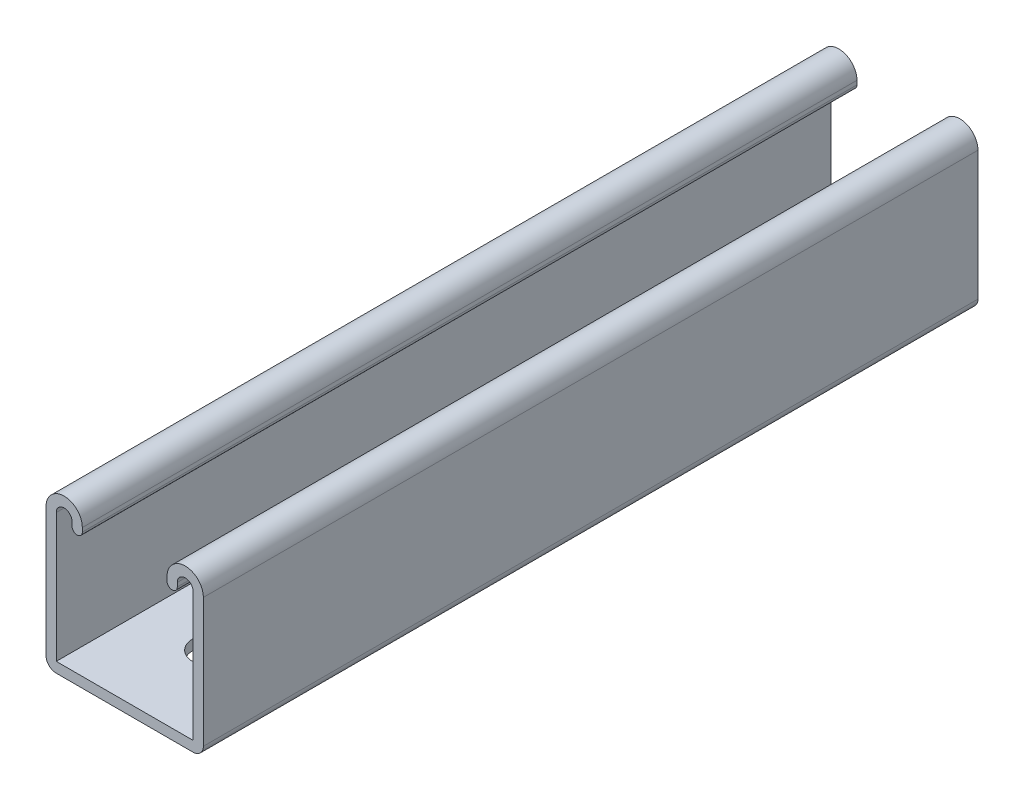
ISO-10303-21;
HEADER;
FILE_DESCRIPTION(('STEP AP214'),'2;1');
FILE_NAME('part.step','',(''),(''),'','','');
FILE_SCHEMA(('AUTOMOTIVE_DESIGN { 1 0 10303 214 1 1 1 1 }'));
ENDSEC;
DATA;
#1=APPLICATION_CONTEXT('core data for automotive mechanical design processes');
#2=APPLICATION_PROTOCOL_DEFINITION('international standard','automotive_design',2000,#1);
#3=PRODUCT_CONTEXT('',#1,'mechanical');
#4=PRODUCT('Part','Part','',(#3));
#5=PRODUCT_RELATED_PRODUCT_CATEGORY('part','',(#4));
#6=PRODUCT_DEFINITION_FORMATION('','',#4);
#7=PRODUCT_DEFINITION_CONTEXT('part definition',#1,'design');
#8=PRODUCT_DEFINITION('design','',#6,#7);
#9=PRODUCT_DEFINITION_SHAPE('','',#8);
#10=(LENGTH_UNIT() NAMED_UNIT(*) SI_UNIT(.MILLI.,.METRE.));
#11=(NAMED_UNIT(*) PLANE_ANGLE_UNIT() SI_UNIT($,.RADIAN.));
#12=(NAMED_UNIT(*) SI_UNIT($,.STERADIAN.) SOLID_ANGLE_UNIT());
#13=UNCERTAINTY_MEASURE_WITH_UNIT(LENGTH_MEASURE(1.E-05),#10,'distance_accuracy_value','');
#14=(GEOMETRIC_REPRESENTATION_CONTEXT(3) GLOBAL_UNCERTAINTY_ASSIGNED_CONTEXT((#13)) GLOBAL_UNIT_ASSIGNED_CONTEXT((#10,
#11,#12)) REPRESENTATION_CONTEXT('',''));
#15=CARTESIAN_POINT('',(0.,0.,0.));
#16=DIRECTION('',(0.,0.,1.));
#17=DIRECTION('',(1.,0.,0.));
#18=AXIS2_PLACEMENT_3D('',#15,#16,#17);
#19=CARTESIAN_POINT('',(-15.875,18.4785,203.2));
#20=DIRECTION('',(0.,0.,-1.));
#21=DIRECTION('',(-1.,0.,0.));
#22=AXIS2_PLACEMENT_3D('',#19,#20,#21);
#23=CYLINDRICAL_SURFACE('',#22,4.7625);
#24=CARTESIAN_POINT('',(-15.875,18.4785,0.));
#25=DIRECTION('',(0.,0.,1.));
#26=DIRECTION('',(-1.,0.,0.));
#27=AXIS2_PLACEMENT_3D('',#24,#25,#26);
#28=CIRCLE('',#27,4.7625);
#29=CARTESIAN_POINT('',(-11.1125,18.4785,0.));
#30=VERTEX_POINT('',#29);
#31=CARTESIAN_POINT('',(-20.6375,18.4785,0.));
#32=VERTEX_POINT('',#31);
#33=EDGE_CURVE('E253',#30,#32,#28,.T.);
#34=ORIENTED_EDGE('',*,*,#33,.T.);
#35=DIRECTION('',(0.,0.,-1.));
#36=VECTOR('',#35,1.);
#37=CARTESIAN_POINT('',(-20.6375,18.4785,203.2));
#38=LINE('',#37,#36);
#39=CARTESIAN_POINT('',(-20.6375,18.4785,203.2));
#40=VERTEX_POINT('',#39);
#41=EDGE_CURVE('E384',#40,#32,#38,.T.);
#42=ORIENTED_EDGE('',*,*,#41,.F.);
#43=CARTESIAN_POINT('',(-15.875,18.4785,203.2));
#44=DIRECTION('',(0.,0.,1.));
#45=DIRECTION('',(-1.,0.,0.));
#46=AXIS2_PLACEMENT_3D('',#43,#44,#45);
#47=CIRCLE('',#46,4.7625);
#48=CARTESIAN_POINT('',(-11.1125,18.4785,203.2));
#49=VERTEX_POINT('',#48);
#50=EDGE_CURVE('E260',#49,#40,#47,.T.);
#51=ORIENTED_EDGE('',*,*,#50,.F.);
#52=DIRECTION('',(0.,0.,-1.));
#53=VECTOR('',#52,1.);
#54=CARTESIAN_POINT('',(-11.1125,18.4785,203.2));
#55=LINE('',#54,#53);
#56=EDGE_CURVE('E298',#49,#30,#55,.T.);
#57=ORIENTED_EDGE('',*,*,#56,.T.);
#58=EDGE_LOOP('',(#34,#42,#51,#57));
#59=FACE_BOUND('',#58,.T.);
#60=ADVANCED_FACE('F32',(#59),#23,.T.);
#61=CARTESIAN_POINT('',(-20.6375,18.4785,203.2));
#62=DIRECTION('',(1.,0.,0.));
#63=DIRECTION('',(0.,1.,0.));
#64=AXIS2_PLACEMENT_3D('',#61,#62,#63);
#65=PLANE('',#64);
#66=DIRECTION('',(0.,-1.,0.));
#67=VECTOR('',#66,1.);
#68=CARTESIAN_POINT('',(-20.6375,18.4785,0.));
#69=LINE('',#68,#67);
#70=CARTESIAN_POINT('',(-20.6375,-15.3416,0.));
#71=VERTEX_POINT('',#70);
#72=EDGE_CURVE('E301',#32,#71,#69,.T.);
#73=ORIENTED_EDGE('',*,*,#72,.T.);
#74=DIRECTION('',(0.,0.,-1.));
#75=VECTOR('',#74,1.);
#76=CARTESIAN_POINT('',(-20.6375,-15.3416,203.2));
#77=LINE('',#76,#75);
#78=CARTESIAN_POINT('',(-20.6375,-15.3416,203.2));
#79=VERTEX_POINT('',#78);
#80=EDGE_CURVE('E381',#79,#71,#77,.T.);
#81=ORIENTED_EDGE('',*,*,#80,.F.);
#82=DIRECTION('',(0.,-1.,0.));
#83=VECTOR('',#82,1.);
#84=CARTESIAN_POINT('',(-20.6375,18.4785,203.2));
#85=LINE('',#84,#83);
#86=EDGE_CURVE('E263',#40,#79,#85,.T.);
#87=ORIENTED_EDGE('',*,*,#86,.F.);
#88=ORIENTED_EDGE('',*,*,#41,.T.);
#89=EDGE_LOOP('',(#73,#81,#87,#88));
#90=FACE_BOUND('',#89,.T.);
#91=ADVANCED_FACE('F425',(#90),#65,.F.);
#92=CARTESIAN_POINT('',(-17.9451,-15.3416,203.2));
#93=DIRECTION('',(0.,0.,-1.));
#94=DIRECTION('',(-1.,0.,0.));
#95=AXIS2_PLACEMENT_3D('',#92,#93,#94);
#96=CYLINDRICAL_SURFACE('',#95,2.6924);
#97=CARTESIAN_POINT('',(-17.9451,-15.3416,0.));
#98=DIRECTION('',(0.,0.,1.));
#99=DIRECTION('',(-1.,0.,0.));
#100=AXIS2_PLACEMENT_3D('',#97,#98,#99);
#101=CIRCLE('',#100,2.6924);
#102=CARTESIAN_POINT('',(-17.9451,-18.034,0.));
#103=VERTEX_POINT('',#102);
#104=EDGE_CURVE('E303',#71,#103,#101,.T.);
#105=ORIENTED_EDGE('',*,*,#104,.T.);
#106=DIRECTION('',(0.,0.,-1.));
#107=VECTOR('',#106,1.);
#108=CARTESIAN_POINT('',(-17.9451,-18.034,203.2));
#109=LINE('',#108,#107);
#110=CARTESIAN_POINT('',(-17.9451,-18.034,203.2));
#111=VERTEX_POINT('',#110);
#112=EDGE_CURVE('E378',#111,#103,#109,.T.);
#113=ORIENTED_EDGE('',*,*,#112,.F.);
#114=CARTESIAN_POINT('',(-17.9451,-15.3416,203.2));
#115=DIRECTION('',(0.,0.,1.));
#116=DIRECTION('',(-1.,0.,0.));
#117=AXIS2_PLACEMENT_3D('',#114,#115,#116);
#118=CIRCLE('',#117,2.6924);
#119=EDGE_CURVE('E266',#79,#111,#118,.T.);
#120=ORIENTED_EDGE('',*,*,#119,.F.);
#121=ORIENTED_EDGE('',*,*,#80,.T.);
#122=EDGE_LOOP('',(#105,#113,#120,#121));
#123=FACE_BOUND('',#122,.T.);
#124=ADVANCED_FACE('F430',(#123),#96,.T.);
#125=CARTESIAN_POINT('',(-17.9451,-18.034,203.2));
#126=DIRECTION('',(0.,1.,0.));
#127=DIRECTION('',(-1.,0.,0.));
#128=AXIS2_PLACEMENT_3D('',#125,#126,#127);
#129=PLANE('',#128);
#130=DIRECTION('',(0.,0.,-1.));
#131=VECTOR('',#130,1.);
#132=CARTESIAN_POINT('',(-5.159375,-18.0340000000001,114.3));
#133=LINE('',#132,#131);
#134=CARTESIAN_POINT('',(-5.15937500000001,-18.034,180.18125));
#135=VERTEX_POINT('',#134);
#136=CARTESIAN_POINT('',(-5.159375,-18.0340000000001,114.3));
#137=VERTEX_POINT('',#136);
#138=EDGE_CURVE('E206',#135,#137,#133,.T.);
#139=ORIENTED_EDGE('',*,*,#138,.F.);
#140=CARTESIAN_POINT('',(0.,-18.0340000000001,180.18125));
#141=DIRECTION('',(0.,-1.,0.));
#142=DIRECTION('',(1.,0.,0.));
#143=AXIS2_PLACEMENT_3D('',#140,#141,#142);
#144=CIRCLE('',#143,5.159375);
#145=CARTESIAN_POINT('',(5.159375,-18.0340000000001,180.18125));
#146=VERTEX_POINT('',#145);
#147=EDGE_CURVE('E46',#146,#135,#144,.T.);
#148=ORIENTED_EDGE('',*,*,#147,.F.);
#149=DIRECTION('',(0.,0.,1.));
#150=VECTOR('',#149,1.);
#151=CARTESIAN_POINT('',(5.159375,-18.0340000000001,180.18125));
#152=LINE('',#151,#150);
#153=CARTESIAN_POINT('',(5.159375,-18.0340000000001,114.3));
#154=VERTEX_POINT('',#153);
#155=EDGE_CURVE('E222',#154,#146,#152,.T.);
#156=ORIENTED_EDGE('',*,*,#155,.F.);
#157=CARTESIAN_POINT('',(0.,-18.0340000000001,114.3));
#158=DIRECTION('',(0.,-1.,0.));
#159=DIRECTION('',(1.,0.,0.));
#160=AXIS2_PLACEMENT_3D('',#157,#158,#159);
#161=CIRCLE('',#160,5.159375);
#162=EDGE_CURVE('E216',#137,#154,#161,.T.);
#163=ORIENTED_EDGE('',*,*,#162,.F.);
#164=EDGE_LOOP('',(#139,#148,#156,#163));
#165=FACE_BOUND('',#164,.T.);
#166=DIRECTION('',(0.,0.,-1.));
#167=VECTOR('',#166,1.);
#168=CARTESIAN_POINT('',(-5.159375,-18.0340000000001,12.7));
#169=LINE('',#168,#167);
#170=CARTESIAN_POINT('',(-5.15937500000001,-18.034,78.58125));
#171=VERTEX_POINT('',#170);
#172=CARTESIAN_POINT('',(-5.159375,-18.0340000000001,12.7));
#173=VERTEX_POINT('',#172);
#174=EDGE_CURVE('E241',#171,#173,#169,.T.);
#175=ORIENTED_EDGE('',*,*,#174,.F.);
#176=CARTESIAN_POINT('',(0.,-18.0340000000001,78.58125));
#177=DIRECTION('',(0.,-1.,0.));
#178=DIRECTION('',(1.,0.,0.));
#179=AXIS2_PLACEMENT_3D('',#176,#177,#178);
#180=CIRCLE('',#179,5.159375);
#181=CARTESIAN_POINT('',(5.159375,-18.0340000000001,78.58125));
#182=VERTEX_POINT('',#181);
#183=EDGE_CURVE('E239',#182,#171,#180,.T.);
#184=ORIENTED_EDGE('',*,*,#183,.F.);
#185=DIRECTION('',(0.,0.,1.));
#186=VECTOR('',#185,1.);
#187=CARTESIAN_POINT('',(5.159375,-18.0340000000001,78.58125));
#188=LINE('',#187,#186);
#189=CARTESIAN_POINT('',(5.159375,-18.0340000000001,12.7));
#190=VERTEX_POINT('',#189);
#191=EDGE_CURVE('E247',#190,#182,#188,.T.);
#192=ORIENTED_EDGE('',*,*,#191,.F.);
#193=CARTESIAN_POINT('',(0.,-18.0340000000001,12.7));
#194=DIRECTION('',(0.,-1.,0.));
#195=DIRECTION('',(1.,0.,0.));
#196=AXIS2_PLACEMENT_3D('',#193,#194,#195);
#197=CIRCLE('',#196,5.159375);
#198=EDGE_CURVE('E244',#173,#190,#197,.T.);
#199=ORIENTED_EDGE('',*,*,#198,.F.);
#200=EDGE_LOOP('',(#175,#184,#192,#199));
#201=FACE_BOUND('',#200,.T.);
#202=DIRECTION('',(1.,0.,0.));
#203=VECTOR('',#202,1.);
#204=CARTESIAN_POINT('',(-17.9451,-18.034,0.));
#205=LINE('',#204,#203);
#206=CARTESIAN_POINT('',(17.9451,-18.034,0.));
#207=VERTEX_POINT('',#206);
#208=EDGE_CURVE('E305',#103,#207,#205,.T.);
#209=ORIENTED_EDGE('',*,*,#208,.T.);
#210=DIRECTION('',(0.,0.,-1.));
#211=VECTOR('',#210,1.);
#212=CARTESIAN_POINT('',(17.9451,-18.034,203.2));
#213=LINE('',#212,#211);
#214=CARTESIAN_POINT('',(17.9451,-18.034,203.2));
#215=VERTEX_POINT('',#214);
#216=EDGE_CURVE('E375',#215,#207,#213,.T.);
#217=ORIENTED_EDGE('',*,*,#216,.F.);
#218=DIRECTION('',(1.,0.,0.));
#219=VECTOR('',#218,1.);
#220=CARTESIAN_POINT('',(-17.9451,-18.034,203.2));
#221=LINE('',#220,#219);
#222=EDGE_CURVE('E268',#111,#215,#221,.T.);
#223=ORIENTED_EDGE('',*,*,#222,.F.);
#224=ORIENTED_EDGE('',*,*,#112,.T.);
#225=EDGE_LOOP('',(#209,#217,#223,#224));
#226=FACE_BOUND('',#225,.T.);
#227=ADVANCED_FACE('F220',(#165,#201,#226),#129,.F.);
#228=CARTESIAN_POINT('',(17.9451,-15.3416,203.2));
#229=DIRECTION('',(0.,0.,-1.));
#230=DIRECTION('',(-1.,0.,0.));
#231=AXIS2_PLACEMENT_3D('',#228,#229,#230);
#232=CYLINDRICAL_SURFACE('',#231,2.6924);
#233=CARTESIAN_POINT('',(17.9451,-15.3416,0.));
#234=DIRECTION('',(0.,0.,1.));
#235=DIRECTION('',(1.,0.,0.));
#236=AXIS2_PLACEMENT_3D('',#233,#234,#235);
#237=CIRCLE('',#236,2.6924);
#238=CARTESIAN_POINT('',(20.6375,-15.3416,0.));
#239=VERTEX_POINT('',#238);
#240=EDGE_CURVE('E307',#207,#239,#237,.T.);
#241=ORIENTED_EDGE('',*,*,#240,.T.);
#242=DIRECTION('',(0.,0.,-1.));
#243=VECTOR('',#242,1.);
#244=CARTESIAN_POINT('',(20.6375,-15.3416,203.2));
#245=LINE('',#244,#243);
#246=CARTESIAN_POINT('',(20.6375,-15.3416,203.2));
#247=VERTEX_POINT('',#246);
#248=EDGE_CURVE('E372',#247,#239,#245,.T.);
#249=ORIENTED_EDGE('',*,*,#248,.F.);
#250=CARTESIAN_POINT('',(17.9451,-15.3416,203.2));
#251=DIRECTION('',(0.,0.,1.));
#252=DIRECTION('',(1.,0.,0.));
#253=AXIS2_PLACEMENT_3D('',#250,#251,#252);
#254=CIRCLE('',#253,2.6924);
#255=EDGE_CURVE('E270',#215,#247,#254,.T.);
#256=ORIENTED_EDGE('',*,*,#255,.F.);
#257=ORIENTED_EDGE('',*,*,#216,.T.);
#258=EDGE_LOOP('',(#241,#249,#256,#257));
#259=FACE_BOUND('',#258,.T.);
#260=ADVANCED_FACE('F510',(#259),#232,.T.);
#261=CARTESIAN_POINT('',(20.6375,-15.3416,203.2));
#262=DIRECTION('',(-1.,0.,0.));
#263=DIRECTION('',(0.,0.,1.));
#264=AXIS2_PLACEMENT_3D('',#261,#262,#263);
#265=PLANE('',#264);
#266=DIRECTION('',(0.,1.,0.));
#267=VECTOR('',#266,1.);
#268=CARTESIAN_POINT('',(20.6375,-15.3416,0.));
#269=LINE('',#268,#267);
#270=CARTESIAN_POINT('',(20.6375,18.4785,0.));
#271=VERTEX_POINT('',#270);
#272=EDGE_CURVE('E309',#239,#271,#269,.T.);
#273=ORIENTED_EDGE('',*,*,#272,.T.);
#274=DIRECTION('',(0.,0.,-1.));
#275=VECTOR('',#274,1.);
#276=CARTESIAN_POINT('',(20.6375,18.4785,203.2));
#277=LINE('',#276,#275);
#278=CARTESIAN_POINT('',(20.6375,18.4785,203.2));
#279=VERTEX_POINT('',#278);
#280=EDGE_CURVE('E369',#279,#271,#277,.T.);
#281=ORIENTED_EDGE('',*,*,#280,.F.);
#282=DIRECTION('',(0.,1.,0.));
#283=VECTOR('',#282,1.);
#284=CARTESIAN_POINT('',(20.6375,-15.3416,203.2));
#285=LINE('',#284,#283);
#286=EDGE_CURVE('E272',#247,#279,#285,.T.);
#287=ORIENTED_EDGE('',*,*,#286,.F.);
#288=ORIENTED_EDGE('',*,*,#248,.T.);
#289=EDGE_LOOP('',(#273,#281,#287,#288));
#290=FACE_BOUND('',#289,.T.);
#291=ADVANCED_FACE('F506',(#290),#265,.F.);
#292=CARTESIAN_POINT('',(15.875,18.4785,203.2));
#293=DIRECTION('',(0.,0.,-1.));
#294=DIRECTION('',(-1.,0.,0.));
#295=AXIS2_PLACEMENT_3D('',#292,#293,#294);
#296=CYLINDRICAL_SURFACE('',#295,4.7625);
#297=CARTESIAN_POINT('',(15.875,18.4785,0.));
#298=DIRECTION('',(0.,0.,1.));
#299=DIRECTION('',(1.,0.,0.));
#300=AXIS2_PLACEMENT_3D('',#297,#298,#299);
#301=CIRCLE('',#300,4.7625);
#302=CARTESIAN_POINT('',(11.1125,18.4785,0.));
#303=VERTEX_POINT('',#302);
#304=EDGE_CURVE('E311',#271,#303,#301,.T.);
#305=ORIENTED_EDGE('',*,*,#304,.T.);
#306=DIRECTION('',(0.,0.,-1.));
#307=VECTOR('',#306,1.);
#308=CARTESIAN_POINT('',(11.1125,18.4785,203.2));
#309=LINE('',#308,#307);
#310=CARTESIAN_POINT('',(11.1125,18.4785,203.2));
#311=VERTEX_POINT('',#310);
#312=EDGE_CURVE('E366',#311,#303,#309,.T.);
#313=ORIENTED_EDGE('',*,*,#312,.F.);
#314=CARTESIAN_POINT('',(15.875,18.4785,203.2));
#315=DIRECTION('',(0.,0.,1.));
#316=DIRECTION('',(1.,0.,0.));
#317=AXIS2_PLACEMENT_3D('',#314,#315,#316);
#318=CIRCLE('',#317,4.7625);
#319=EDGE_CURVE('E274',#279,#311,#318,.T.);
#320=ORIENTED_EDGE('',*,*,#319,.F.);
#321=ORIENTED_EDGE('',*,*,#280,.T.);
#322=EDGE_LOOP('',(#305,#313,#320,#321));
#323=FACE_BOUND('',#322,.T.);
#324=ADVANCED_FACE('F501',(#323),#296,.T.);
#325=CARTESIAN_POINT('',(11.1125,18.4785,203.2));
#326=DIRECTION('',(1.,0.,0.));
#327=DIRECTION('',(0.,1.,0.));
#328=AXIS2_PLACEMENT_3D('',#325,#326,#327);
#329=PLANE('',#328);
#330=DIRECTION('',(0.,-1.,0.));
#331=VECTOR('',#330,1.);
#332=CARTESIAN_POINT('',(11.1125,18.4785,0.));
#333=LINE('',#332,#331);
#334=CARTESIAN_POINT('',(11.1125,17.44345,0.));
#335=VERTEX_POINT('',#334);
#336=EDGE_CURVE('E313',#303,#335,#333,.T.);
#337=ORIENTED_EDGE('',*,*,#336,.T.);
#338=DIRECTION('',(0.,0.,-1.));
#339=VECTOR('',#338,1.);
#340=CARTESIAN_POINT('',(11.1125,17.44345,203.2));
#341=LINE('',#340,#339);
#342=CARTESIAN_POINT('',(11.1125,17.44345,203.2));
#343=VERTEX_POINT('',#342);
#344=EDGE_CURVE('E363',#343,#335,#341,.T.);
#345=ORIENTED_EDGE('',*,*,#344,.F.);
#346=DIRECTION('',(0.,-1.,0.));
#347=VECTOR('',#346,1.);
#348=CARTESIAN_POINT('',(11.1125,18.4785,203.2));
#349=LINE('',#348,#347);
#350=EDGE_CURVE('E276',#311,#343,#349,.T.);
#351=ORIENTED_EDGE('',*,*,#350,.F.);
#352=ORIENTED_EDGE('',*,*,#312,.T.);
#353=EDGE_LOOP('',(#337,#345,#351,#352));
#354=FACE_BOUND('',#353,.T.);
#355=ADVANCED_FACE('F495',(#354),#329,.F.);
#356=CARTESIAN_POINT('',(12.4587,17.44345,203.2));
#357=DIRECTION('',(0.,0.,-1.));
#358=DIRECTION('',(-1.,0.,0.));
#359=AXIS2_PLACEMENT_3D('',#356,#357,#358);
#360=CYLINDRICAL_SURFACE('',#359,1.3462);
#361=CARTESIAN_POINT('',(12.4587,17.44345,0.));
#362=DIRECTION('',(0.,0.,1.));
#363=DIRECTION('',(1.,0.,0.));
#364=AXIS2_PLACEMENT_3D('',#361,#362,#363);
#365=CIRCLE('',#364,1.3462);
#366=CARTESIAN_POINT('',(13.8049,17.44345,0.));
#367=VERTEX_POINT('',#366);
#368=EDGE_CURVE('E315',#335,#367,#365,.T.);
#369=ORIENTED_EDGE('',*,*,#368,.T.);
#370=DIRECTION('',(0.,0.,-1.));
#371=VECTOR('',#370,1.);
#372=CARTESIAN_POINT('',(13.8049,17.44345,203.2));
#373=LINE('',#372,#371);
#374=CARTESIAN_POINT('',(13.8049,17.44345,203.2));
#375=VERTEX_POINT('',#374);
#376=EDGE_CURVE('E360',#375,#367,#373,.T.);
#377=ORIENTED_EDGE('',*,*,#376,.F.);
#378=CARTESIAN_POINT('',(12.4587,17.44345,203.2));
#379=DIRECTION('',(0.,0.,1.));
#380=DIRECTION('',(1.,0.,0.));
#381=AXIS2_PLACEMENT_3D('',#378,#379,#380);
#382=CIRCLE('',#381,1.3462);
#383=EDGE_CURVE('E278',#343,#375,#382,.T.);
#384=ORIENTED_EDGE('',*,*,#383,.F.);
#385=ORIENTED_EDGE('',*,*,#344,.T.);
#386=EDGE_LOOP('',(#369,#377,#384,#385));
#387=FACE_BOUND('',#386,.T.);
#388=ADVANCED_FACE('F491',(#387),#360,.T.);
#389=CARTESIAN_POINT('',(13.8049,18.4785,203.2));
#390=DIRECTION('',(-1.,0.,0.));
#391=DIRECTION('',(0.,0.,1.));
#392=AXIS2_PLACEMENT_3D('',#389,#390,#391);
#393=PLANE('',#392);
#394=DIRECTION('',(0.,1.,0.));
#395=VECTOR('',#394,1.);
#396=CARTESIAN_POINT('',(13.8049,18.4785,0.));
#397=LINE('',#396,#395);
#398=CARTESIAN_POINT('',(13.8049,18.4785,0.));
#399=VERTEX_POINT('',#398);
#400=EDGE_CURVE('E317',#367,#399,#397,.T.);
#401=ORIENTED_EDGE('',*,*,#400,.T.);
#402=DIRECTION('',(0.,0.,-1.));
#403=VECTOR('',#402,1.);
#404=CARTESIAN_POINT('',(13.8049,18.4785,203.2));
#405=LINE('',#404,#403);
#406=CARTESIAN_POINT('',(13.8049,18.4785,203.2));
#407=VERTEX_POINT('',#406);
#408=EDGE_CURVE('E357',#407,#399,#405,.T.);
#409=ORIENTED_EDGE('',*,*,#408,.F.);
#410=DIRECTION('',(0.,1.,0.));
#411=VECTOR('',#410,1.);
#412=CARTESIAN_POINT('',(13.8049,18.4785,203.2));
#413=LINE('',#412,#411);
#414=EDGE_CURVE('E280',#375,#407,#413,.T.);
#415=ORIENTED_EDGE('',*,*,#414,.F.);
#416=ORIENTED_EDGE('',*,*,#376,.T.);
#417=EDGE_LOOP('',(#401,#409,#415,#416));
#418=FACE_BOUND('',#417,.T.);
#419=ADVANCED_FACE('F486',(#418),#393,.F.);
#420=CARTESIAN_POINT('',(15.875,18.4785,203.2));
#421=DIRECTION('',(0.,0.,-1.));
#422=DIRECTION('',(-1.,0.,0.));
#423=AXIS2_PLACEMENT_3D('',#420,#421,#422);
#424=CYLINDRICAL_SURFACE('',#423,2.0701);
#425=CARTESIAN_POINT('',(15.875,18.4785,0.));
#426=DIRECTION('',(0.,0.,-1.));
#427=DIRECTION('',(1.,0.,0.));
#428=AXIS2_PLACEMENT_3D('',#425,#426,#427);
#429=CIRCLE('',#428,2.0701);
#430=CARTESIAN_POINT('',(17.9451,18.4785,0.));
#431=VERTEX_POINT('',#430);
#432=EDGE_CURVE('E319',#399,#431,#429,.T.);
#433=ORIENTED_EDGE('',*,*,#432,.T.);
#434=DIRECTION('',(0.,0.,-1.));
#435=VECTOR('',#434,1.);
#436=CARTESIAN_POINT('',(17.9451,18.4785,203.2));
#437=LINE('',#436,#435);
#438=CARTESIAN_POINT('',(17.9451,18.4785,203.2));
#439=VERTEX_POINT('',#438);
#440=EDGE_CURVE('E354',#439,#431,#437,.T.);
#441=ORIENTED_EDGE('',*,*,#440,.F.);
#442=CARTESIAN_POINT('',(15.875,18.4785,203.2));
#443=DIRECTION('',(0.,0.,-1.));
#444=DIRECTION('',(1.,0.,0.));
#445=AXIS2_PLACEMENT_3D('',#442,#443,#444);
#446=CIRCLE('',#445,2.0701);
#447=EDGE_CURVE('E282',#407,#439,#446,.T.);
#448=ORIENTED_EDGE('',*,*,#447,.F.);
#449=ORIENTED_EDGE('',*,*,#408,.T.);
#450=EDGE_LOOP('',(#433,#441,#448,#449));
#451=FACE_BOUND('',#450,.T.);
#452=ADVANCED_FACE('F480',(#451),#424,.F.);
#453=CARTESIAN_POINT('',(17.9451,-15.3416,203.2));
#454=DIRECTION('',(1.,0.,0.));
#455=DIRECTION('',(0.,1.,0.));
#456=AXIS2_PLACEMENT_3D('',#453,#454,#455);
#457=PLANE('',#456);
#458=DIRECTION('',(0.,-1.,0.));
#459=VECTOR('',#458,1.);
#460=CARTESIAN_POINT('',(17.9451,-15.3416,0.));
#461=LINE('',#460,#459);
#462=CARTESIAN_POINT('',(17.9451,-15.3416,0.));
#463=VERTEX_POINT('',#462);
#464=EDGE_CURVE('E321',#431,#463,#461,.T.);
#465=ORIENTED_EDGE('',*,*,#464,.T.);
#466=DIRECTION('',(0.,0.,-1.));
#467=VECTOR('',#466,1.);
#468=CARTESIAN_POINT('',(17.9451,-15.3416,203.2));
#469=LINE('',#468,#467);
#470=CARTESIAN_POINT('',(17.9451,-15.3416,203.2));
#471=VERTEX_POINT('',#470);
#472=EDGE_CURVE('E351',#471,#463,#469,.T.);
#473=ORIENTED_EDGE('',*,*,#472,.F.);
#474=DIRECTION('',(0.,-1.,0.));
#475=VECTOR('',#474,1.);
#476=CARTESIAN_POINT('',(17.9451,-15.3416,203.2));
#477=LINE('',#476,#475);
#478=EDGE_CURVE('E284',#439,#471,#477,.T.);
#479=ORIENTED_EDGE('',*,*,#478,.F.);
#480=ORIENTED_EDGE('',*,*,#440,.T.);
#481=EDGE_LOOP('',(#465,#473,#479,#480));
#482=FACE_BOUND('',#481,.T.);
#483=ADVANCED_FACE('F476',(#482),#457,.F.);
#484=CARTESIAN_POINT('',(-17.9451,-15.3416,203.2));
#485=DIRECTION('',(0.,-1.,0.));
#486=DIRECTION('',(1.,0.,0.));
#487=AXIS2_PLACEMENT_3D('',#484,#485,#486);
#488=PLANE('',#487);
#489=DIRECTION('',(0.,0.,1.));
#490=VECTOR('',#489,1.);
#491=CARTESIAN_POINT('',(5.159375,-15.3416,304.8));
#492=LINE('',#491,#490);
#493=CARTESIAN_POINT('',(5.159375,-15.3416,114.3));
#494=VERTEX_POINT('',#493);
#495=CARTESIAN_POINT('',(5.159375,-15.3416,180.18125));
#496=VERTEX_POINT('',#495);
#497=EDGE_CURVE('E232',#494,#496,#492,.T.);
#498=ORIENTED_EDGE('',*,*,#497,.T.);
#499=CARTESIAN_POINT('',(0.,-15.3416,180.18125));
#500=DIRECTION('',(0.,-1.,0.));
#501=DIRECTION('',(1.,0.,0.));
#502=AXIS2_PLACEMENT_3D('',#499,#500,#501);
#503=CIRCLE('',#502,5.159375);
#504=CARTESIAN_POINT('',(-5.15937500000001,-15.3416,180.18125));
#505=VERTEX_POINT('',#504);
#506=EDGE_CURVE('E236',#496,#505,#503,.T.);
#507=ORIENTED_EDGE('',*,*,#506,.T.);
#508=DIRECTION('',(0.,0.,-1.));
#509=VECTOR('',#508,1.);
#510=CARTESIAN_POINT('',(-5.15937500000002,-15.3416,304.8));
#511=LINE('',#510,#509);
#512=CARTESIAN_POINT('',(-5.159375,-15.3416,114.3));
#513=VERTEX_POINT('',#512);
#514=EDGE_CURVE('E213',#505,#513,#511,.T.);
#515=ORIENTED_EDGE('',*,*,#514,.T.);
#516=CARTESIAN_POINT('',(0.,-15.3416,114.3));
#517=DIRECTION('',(0.,-1.,0.));
#518=DIRECTION('',(1.,0.,0.));
#519=AXIS2_PLACEMENT_3D('',#516,#517,#518);
#520=CIRCLE('',#519,5.159375);
#521=EDGE_CURVE('E54',#513,#494,#520,.T.);
#522=ORIENTED_EDGE('',*,*,#521,.T.);
#523=EDGE_LOOP('',(#498,#507,#515,#522));
#524=FACE_BOUND('',#523,.T.);
#525=DIRECTION('',(0.,0.,1.));
#526=VECTOR('',#525,1.);
#527=CARTESIAN_POINT('',(5.159375,-15.3416,203.2));
#528=LINE('',#527,#526);
#529=CARTESIAN_POINT('',(5.159375,-15.3416,12.7));
#530=VERTEX_POINT('',#529);
#531=CARTESIAN_POINT('',(5.159375,-15.3416,78.58125));
#532=VERTEX_POINT('',#531);
#533=EDGE_CURVE('E39',#530,#532,#528,.T.);
#534=ORIENTED_EDGE('',*,*,#533,.T.);
#535=CARTESIAN_POINT('',(0.,-15.3416,78.58125));
#536=DIRECTION('',(0.,-1.,0.));
#537=DIRECTION('',(1.,0.,0.));
#538=AXIS2_PLACEMENT_3D('',#535,#536,#537);
#539=CIRCLE('',#538,5.159375);
#540=CARTESIAN_POINT('',(-5.15937500000001,-15.3416,78.58125));
#541=VERTEX_POINT('',#540);
#542=EDGE_CURVE('E11',#532,#541,#539,.T.);
#543=ORIENTED_EDGE('',*,*,#542,.T.);
#544=DIRECTION('',(0.,0.,-1.));
#545=VECTOR('',#544,1.);
#546=CARTESIAN_POINT('',(-5.15937500000002,-15.3416,203.2));
#547=LINE('',#546,#545);
#548=CARTESIAN_POINT('',(-5.159375,-15.3416,12.7));
#549=VERTEX_POINT('',#548);
#550=EDGE_CURVE('E387',#541,#549,#547,.T.);
#551=ORIENTED_EDGE('',*,*,#550,.T.);
#552=CARTESIAN_POINT('',(0.,-15.3416,12.7));
#553=DIRECTION('',(0.,-1.,0.));
#554=DIRECTION('',(1.,0.,0.));
#555=AXIS2_PLACEMENT_3D('',#552,#553,#554);
#556=CIRCLE('',#555,5.159375);
#557=EDGE_CURVE('E390',#549,#530,#556,.T.);
#558=ORIENTED_EDGE('',*,*,#557,.T.);
#559=EDGE_LOOP('',(#534,#543,#551,#558));
#560=FACE_BOUND('',#559,.T.);
#561=DIRECTION('',(-1.,0.,0.));
#562=VECTOR('',#561,1.);
#563=CARTESIAN_POINT('',(-17.9451,-15.3416,0.));
#564=LINE('',#563,#562);
#565=CARTESIAN_POINT('',(-17.9451,-15.3416,0.));
#566=VERTEX_POINT('',#565);
#567=EDGE_CURVE('E323',#463,#566,#564,.T.);
#568=ORIENTED_EDGE('',*,*,#567,.T.);
#569=DIRECTION('',(0.,0.,-1.));
#570=VECTOR('',#569,1.);
#571=CARTESIAN_POINT('',(-17.9451,-15.3416,203.2));
#572=LINE('',#571,#570);
#573=CARTESIAN_POINT('',(-17.9451,-15.3416,203.2));
#574=VERTEX_POINT('',#573);
#575=EDGE_CURVE('E348',#574,#566,#572,.T.);
#576=ORIENTED_EDGE('',*,*,#575,.F.);
#577=DIRECTION('',(-1.,0.,0.));
#578=VECTOR('',#577,1.);
#579=CARTESIAN_POINT('',(-17.9451,-15.3416,203.2));
#580=LINE('',#579,#578);
#581=EDGE_CURVE('E286',#471,#574,#580,.T.);
#582=ORIENTED_EDGE('',*,*,#581,.F.);
#583=ORIENTED_EDGE('',*,*,#472,.T.);
#584=EDGE_LOOP('',(#568,#576,#582,#583));
#585=FACE_BOUND('',#584,.T.);
#586=ADVANCED_FACE('F394',(#524,#560,#585),#488,.F.);
#587=CARTESIAN_POINT('',(-17.9451,18.4785,203.2));
#588=DIRECTION('',(-1.,0.,0.));
#589=DIRECTION('',(0.,-1.,0.));
#590=AXIS2_PLACEMENT_3D('',#587,#588,#589);
#591=PLANE('',#590);
#592=DIRECTION('',(0.,1.,0.));
#593=VECTOR('',#592,1.);
#594=CARTESIAN_POINT('',(-17.9451,18.4785,0.));
#595=LINE('',#594,#593);
#596=CARTESIAN_POINT('',(-17.9451,18.4785,0.));
#597=VERTEX_POINT('',#596);
#598=EDGE_CURVE('E325',#566,#597,#595,.T.);
#599=ORIENTED_EDGE('',*,*,#598,.T.);
#600=DIRECTION('',(0.,0.,-1.));
#601=VECTOR('',#600,1.);
#602=CARTESIAN_POINT('',(-17.9451,18.4785,203.2));
#603=LINE('',#602,#601);
#604=CARTESIAN_POINT('',(-17.9451,18.4785,203.2));
#605=VERTEX_POINT('',#604);
#606=EDGE_CURVE('E345',#605,#597,#603,.T.);
#607=ORIENTED_EDGE('',*,*,#606,.F.);
#608=DIRECTION('',(0.,1.,0.));
#609=VECTOR('',#608,1.);
#610=CARTESIAN_POINT('',(-17.9451,18.4785,203.2));
#611=LINE('',#610,#609);
#612=EDGE_CURVE('E288',#574,#605,#611,.T.);
#613=ORIENTED_EDGE('',*,*,#612,.F.);
#614=ORIENTED_EDGE('',*,*,#575,.T.);
#615=EDGE_LOOP('',(#599,#607,#613,#614));
#616=FACE_BOUND('',#615,.T.);
#617=ADVANCED_FACE('F467',(#616),#591,.F.);
#618=CARTESIAN_POINT('',(-15.875,18.4785,203.2));
#619=DIRECTION('',(0.,0.,-1.));
#620=DIRECTION('',(-1.,0.,0.));
#621=AXIS2_PLACEMENT_3D('',#618,#619,#620);
#622=CYLINDRICAL_SURFACE('',#621,2.0701);
#623=CARTESIAN_POINT('',(-15.875,18.4785,0.));
#624=DIRECTION('',(0.,0.,-1.));
#625=DIRECTION('',(-1.,0.,0.));
#626=AXIS2_PLACEMENT_3D('',#623,#624,#625);
#627=CIRCLE('',#626,2.0701);
#628=CARTESIAN_POINT('',(-13.8049,18.4785,0.));
#629=VERTEX_POINT('',#628);
#630=EDGE_CURVE('E327',#597,#629,#627,.T.);
#631=ORIENTED_EDGE('',*,*,#630,.T.);
#632=DIRECTION('',(0.,0.,-1.));
#633=VECTOR('',#632,1.);
#634=CARTESIAN_POINT('',(-13.8049,18.4785,203.2));
#635=LINE('',#634,#633);
#636=CARTESIAN_POINT('',(-13.8049,18.4785,203.2));
#637=VERTEX_POINT('',#636);
#638=EDGE_CURVE('E342',#637,#629,#635,.T.);
#639=ORIENTED_EDGE('',*,*,#638,.F.);
#640=CARTESIAN_POINT('',(-15.875,18.4785,203.2));
#641=DIRECTION('',(0.,0.,-1.));
#642=DIRECTION('',(-1.,0.,0.));
#643=AXIS2_PLACEMENT_3D('',#640,#641,#642);
#644=CIRCLE('',#643,2.0701);
#645=EDGE_CURVE('E290',#605,#637,#644,.T.);
#646=ORIENTED_EDGE('',*,*,#645,.F.);
#647=ORIENTED_EDGE('',*,*,#606,.T.);
#648=EDGE_LOOP('',(#631,#639,#646,#647));
#649=FACE_BOUND('',#648,.T.);
#650=ADVANCED_FACE('F463',(#649),#622,.F.);
#651=CARTESIAN_POINT('',(-13.8049,18.4785,203.2));
#652=DIRECTION('',(1.,0.,0.));
#653=DIRECTION('',(0.,1.,0.));
#654=AXIS2_PLACEMENT_3D('',#651,#652,#653);
#655=PLANE('',#654);
#656=DIRECTION('',(0.,-1.,0.));
#657=VECTOR('',#656,1.);
#658=CARTESIAN_POINT('',(-13.8049,18.4785,0.));
#659=LINE('',#658,#657);
#660=CARTESIAN_POINT('',(-13.8049,17.44345,0.));
#661=VERTEX_POINT('',#660);
#662=EDGE_CURVE('E329',#629,#661,#659,.T.);
#663=ORIENTED_EDGE('',*,*,#662,.T.);
#664=DIRECTION('',(0.,0.,-1.));
#665=VECTOR('',#664,1.);
#666=CARTESIAN_POINT('',(-13.8049,17.44345,203.2));
#667=LINE('',#666,#665);
#668=CARTESIAN_POINT('',(-13.8049,17.44345,203.2));
#669=VERTEX_POINT('',#668);
#670=EDGE_CURVE('E339',#669,#661,#667,.T.);
#671=ORIENTED_EDGE('',*,*,#670,.F.);
#672=DIRECTION('',(0.,-1.,0.));
#673=VECTOR('',#672,1.);
#674=CARTESIAN_POINT('',(-13.8049,18.4785,203.2));
#675=LINE('',#674,#673);
#676=EDGE_CURVE('E292',#637,#669,#675,.T.);
#677=ORIENTED_EDGE('',*,*,#676,.F.);
#678=ORIENTED_EDGE('',*,*,#638,.T.);
#679=EDGE_LOOP('',(#663,#671,#677,#678));
#680=FACE_BOUND('',#679,.T.);
#681=ADVANCED_FACE('F458',(#680),#655,.F.);
#682=CARTESIAN_POINT('',(-12.4587,17.44345,203.2));
#683=DIRECTION('',(0.,0.,-1.));
#684=DIRECTION('',(-1.,0.,0.));
#685=AXIS2_PLACEMENT_3D('',#682,#683,#684);
#686=CYLINDRICAL_SURFACE('',#685,1.3462);
#687=CARTESIAN_POINT('',(-12.4587,17.44345,0.));
#688=DIRECTION('',(0.,0.,1.));
#689=DIRECTION('',(-1.,0.,0.));
#690=AXIS2_PLACEMENT_3D('',#687,#688,#689);
#691=CIRCLE('',#690,1.3462);
#692=CARTESIAN_POINT('',(-11.1125,17.44345,0.));
#693=VERTEX_POINT('',#692);
#694=EDGE_CURVE('E331',#661,#693,#691,.T.);
#695=ORIENTED_EDGE('',*,*,#694,.T.);
#696=DIRECTION('',(0.,0.,-1.));
#697=VECTOR('',#696,1.);
#698=CARTESIAN_POINT('',(-11.1125,17.44345,203.2));
#699=LINE('',#698,#697);
#700=CARTESIAN_POINT('',(-11.1125,17.44345,203.2));
#701=VERTEX_POINT('',#700);
#702=EDGE_CURVE('E336',#701,#693,#699,.T.);
#703=ORIENTED_EDGE('',*,*,#702,.F.);
#704=CARTESIAN_POINT('',(-12.4587,17.44345,203.2));
#705=DIRECTION('',(0.,0.,1.));
#706=DIRECTION('',(-1.,0.,0.));
#707=AXIS2_PLACEMENT_3D('',#704,#705,#706);
#708=CIRCLE('',#707,1.3462);
#709=EDGE_CURVE('E294',#669,#701,#708,.T.);
#710=ORIENTED_EDGE('',*,*,#709,.F.);
#711=ORIENTED_EDGE('',*,*,#670,.T.);
#712=EDGE_LOOP('',(#695,#703,#710,#711));
#713=FACE_BOUND('',#712,.T.);
#714=ADVANCED_FACE('F452',(#713),#686,.T.);
#715=CARTESIAN_POINT('',(-11.1125,18.4785,203.2));
#716=DIRECTION('',(-1.,0.,0.));
#717=DIRECTION('',(0.,0.,1.));
#718=AXIS2_PLACEMENT_3D('',#715,#716,#717);
#719=PLANE('',#718);
#720=DIRECTION('',(0.,1.,0.));
#721=VECTOR('',#720,1.);
#722=CARTESIAN_POINT('',(-11.1125,18.4785,0.));
#723=LINE('',#722,#721);
#724=EDGE_CURVE('E264',#693,#30,#723,.T.);
#725=ORIENTED_EDGE('',*,*,#724,.T.);
#726=ORIENTED_EDGE('',*,*,#56,.F.);
#727=DIRECTION('',(0.,1.,0.));
#728=VECTOR('',#727,1.);
#729=CARTESIAN_POINT('',(-11.1125,18.4785,203.2));
#730=LINE('',#729,#728);
#731=EDGE_CURVE('E296',#701,#49,#730,.T.);
#732=ORIENTED_EDGE('',*,*,#731,.F.);
#733=ORIENTED_EDGE('',*,*,#702,.T.);
#734=EDGE_LOOP('',(#725,#726,#732,#733));
#735=FACE_BOUND('',#734,.T.);
#736=ADVANCED_FACE('F450',(#735),#719,.F.);
#737=CARTESIAN_POINT('',(-15.875,18.4785,203.2));
#738=DIRECTION('',(0.,0.,-1.));
#739=DIRECTION('',(-1.,0.,0.));
#740=AXIS2_PLACEMENT_3D('',#737,#738,#739);
#741=PLANE('',#740);
#742=ORIENTED_EDGE('',*,*,#50,.T.);
#743=ORIENTED_EDGE('',*,*,#86,.T.);
#744=ORIENTED_EDGE('',*,*,#119,.T.);
#745=ORIENTED_EDGE('',*,*,#222,.T.);
#746=ORIENTED_EDGE('',*,*,#255,.T.);
#747=ORIENTED_EDGE('',*,*,#286,.T.);
#748=ORIENTED_EDGE('',*,*,#319,.T.);
#749=ORIENTED_EDGE('',*,*,#350,.T.);
#750=ORIENTED_EDGE('',*,*,#383,.T.);
#751=ORIENTED_EDGE('',*,*,#414,.T.);
#752=ORIENTED_EDGE('',*,*,#447,.T.);
#753=ORIENTED_EDGE('',*,*,#478,.T.);
#754=ORIENTED_EDGE('',*,*,#581,.T.);
#755=ORIENTED_EDGE('',*,*,#612,.T.);
#756=ORIENTED_EDGE('',*,*,#645,.T.);
#757=ORIENTED_EDGE('',*,*,#676,.T.);
#758=ORIENTED_EDGE('',*,*,#709,.T.);
#759=ORIENTED_EDGE('',*,*,#731,.T.);
#760=EDGE_LOOP('',(#742,#743,#744,#745,#746,#747,#748,#749,#750,#751,#752,#753,#754,#755,#756,
#757,#758,#759));
#761=FACE_BOUND('',#760,.T.);
#762=ADVANCED_FACE('F445',(#761),#741,.F.);
#763=CARTESIAN_POINT('',(-15.875,18.4785,0.));
#764=DIRECTION('',(0.,0.,-1.));
#765=DIRECTION('',(-1.,0.,0.));
#766=AXIS2_PLACEMENT_3D('',#763,#764,#765);
#767=PLANE('',#766);
#768=ORIENTED_EDGE('',*,*,#33,.F.);
#769=ORIENTED_EDGE('',*,*,#724,.F.);
#770=ORIENTED_EDGE('',*,*,#694,.F.);
#771=ORIENTED_EDGE('',*,*,#662,.F.);
#772=ORIENTED_EDGE('',*,*,#630,.F.);
#773=ORIENTED_EDGE('',*,*,#598,.F.);
#774=ORIENTED_EDGE('',*,*,#567,.F.);
#775=ORIENTED_EDGE('',*,*,#464,.F.);
#776=ORIENTED_EDGE('',*,*,#432,.F.);
#777=ORIENTED_EDGE('',*,*,#400,.F.);
#778=ORIENTED_EDGE('',*,*,#368,.F.);
#779=ORIENTED_EDGE('',*,*,#336,.F.);
#780=ORIENTED_EDGE('',*,*,#304,.F.);
#781=ORIENTED_EDGE('',*,*,#272,.F.);
#782=ORIENTED_EDGE('',*,*,#240,.F.);
#783=ORIENTED_EDGE('',*,*,#208,.F.);
#784=ORIENTED_EDGE('',*,*,#104,.F.);
#785=ORIENTED_EDGE('',*,*,#72,.F.);
#786=EDGE_LOOP('',(#768,#769,#770,#771,#772,#773,#774,#775,#776,#777,#778,#779,#780,#781,#782,
#783,#784,#785));
#787=FACE_BOUND('',#786,.T.);
#788=ADVANCED_FACE('F438',(#787),#767,.T.);
#789=CARTESIAN_POINT('',(0.,23.241,78.58125));
#790=DIRECTION('',(0.,-1.,0.));
#791=DIRECTION('',(1.,0.,0.));
#792=AXIS2_PLACEMENT_3D('',#789,#790,#791);
#793=CYLINDRICAL_SURFACE('',#792,5.159375);
#794=DIRECTION('',(0.,-1.,0.));
#795=VECTOR('',#794,1.);
#796=CARTESIAN_POINT('',(5.159375,23.241,78.58125));
#797=LINE('',#796,#795);
#798=EDGE_CURVE('E251',#532,#182,#797,.T.);
#799=ORIENTED_EDGE('',*,*,#798,.T.);
#800=ORIENTED_EDGE('',*,*,#183,.T.);
#801=DIRECTION('',(0.,-1.,0.));
#802=VECTOR('',#801,1.);
#803=CARTESIAN_POINT('',(-5.15937500000001,23.241,78.58125));
#804=LINE('',#803,#802);
#805=EDGE_CURVE('E250',#541,#171,#804,.T.);
#806=ORIENTED_EDGE('',*,*,#805,.F.);
#807=ORIENTED_EDGE('',*,*,#542,.F.);
#808=EDGE_LOOP('',(#799,#800,#806,#807));
#809=FACE_BOUND('',#808,.T.);
#810=ADVANCED_FACE('F410',(#809),#793,.F.);
#811=CARTESIAN_POINT('',(5.159375,23.241,78.58125));
#812=DIRECTION('',(1.,0.,0.));
#813=DIRECTION('',(0.,1.,0.));
#814=AXIS2_PLACEMENT_3D('',#811,#812,#813);
#815=PLANE('',#814);
#816=DIRECTION('',(0.,-1.,0.));
#817=VECTOR('',#816,1.);
#818=CARTESIAN_POINT('',(5.159375,23.241,12.7));
#819=LINE('',#818,#817);
#820=EDGE_CURVE('E254',#530,#190,#819,.T.);
#821=ORIENTED_EDGE('',*,*,#820,.T.);
#822=ORIENTED_EDGE('',*,*,#191,.T.);
#823=ORIENTED_EDGE('',*,*,#798,.F.);
#824=ORIENTED_EDGE('',*,*,#533,.F.);
#825=EDGE_LOOP('',(#821,#822,#823,#824));
#826=FACE_BOUND('',#825,.T.);
#827=ADVANCED_FACE('F400',(#826),#815,.F.);
#828=CARTESIAN_POINT('',(0.,23.241,12.7));
#829=DIRECTION('',(0.,-1.,0.));
#830=DIRECTION('',(1.,0.,0.));
#831=AXIS2_PLACEMENT_3D('',#828,#829,#830);
#832=CYLINDRICAL_SURFACE('',#831,5.159375);
#833=DIRECTION('',(0.,-1.,0.));
#834=VECTOR('',#833,1.);
#835=CARTESIAN_POINT('',(-5.159375,23.241,12.7));
#836=LINE('',#835,#834);
#837=EDGE_CURVE('E256',#549,#173,#836,.T.);
#838=ORIENTED_EDGE('',*,*,#837,.T.);
#839=ORIENTED_EDGE('',*,*,#198,.T.);
#840=ORIENTED_EDGE('',*,*,#820,.F.);
#841=ORIENTED_EDGE('',*,*,#557,.F.);
#842=EDGE_LOOP('',(#838,#839,#840,#841));
#843=FACE_BOUND('',#842,.T.);
#844=ADVANCED_FACE('F402',(#843),#832,.F.);
#845=CARTESIAN_POINT('',(-5.159375,23.241,12.7));
#846=DIRECTION('',(-1.,0.,0.));
#847=DIRECTION('',(0.,-1.,0.));
#848=AXIS2_PLACEMENT_3D('',#845,#846,#847);
#849=PLANE('',#848);
#850=ORIENTED_EDGE('',*,*,#805,.T.);
#851=ORIENTED_EDGE('',*,*,#174,.T.);
#852=ORIENTED_EDGE('',*,*,#837,.F.);
#853=ORIENTED_EDGE('',*,*,#550,.F.);
#854=EDGE_LOOP('',(#850,#851,#852,#853));
#855=FACE_BOUND('',#854,.T.);
#856=ADVANCED_FACE('F412',(#855),#849,.F.);
#857=CARTESIAN_POINT('',(0.,23.241,180.18125));
#858=DIRECTION('',(0.,-1.,0.));
#859=DIRECTION('',(1.,0.,0.));
#860=AXIS2_PLACEMENT_3D('',#857,#858,#859);
#861=CYLINDRICAL_SURFACE('',#860,5.159375);
#862=DIRECTION('',(0.,-1.,0.));
#863=VECTOR('',#862,1.);
#864=CARTESIAN_POINT('',(5.159375,23.241,180.18125));
#865=LINE('',#864,#863);
#866=EDGE_CURVE('E230',#496,#146,#865,.T.);
#867=ORIENTED_EDGE('',*,*,#866,.T.);
#868=ORIENTED_EDGE('',*,*,#147,.T.);
#869=DIRECTION('',(0.,-1.,0.));
#870=VECTOR('',#869,1.);
#871=CARTESIAN_POINT('',(-5.15937500000001,23.241,180.18125));
#872=LINE('',#871,#870);
#873=EDGE_CURVE('E210',#505,#135,#872,.T.);
#874=ORIENTED_EDGE('',*,*,#873,.F.);
#875=ORIENTED_EDGE('',*,*,#506,.F.);
#876=EDGE_LOOP('',(#867,#868,#874,#875));
#877=FACE_BOUND('',#876,.T.);
#878=ADVANCED_FACE('F414',(#877),#861,.F.);
#879=CARTESIAN_POINT('',(5.159375,23.241,180.18125));
#880=DIRECTION('',(1.,0.,0.));
#881=DIRECTION('',(0.,1.,0.));
#882=AXIS2_PLACEMENT_3D('',#879,#880,#881);
#883=PLANE('',#882);
#884=DIRECTION('',(0.,-1.,0.));
#885=VECTOR('',#884,1.);
#886=CARTESIAN_POINT('',(5.159375,23.241,114.3));
#887=LINE('',#886,#885);
#888=EDGE_CURVE('E223',#494,#154,#887,.T.);
#889=ORIENTED_EDGE('',*,*,#888,.T.);
#890=ORIENTED_EDGE('',*,*,#155,.T.);
#891=ORIENTED_EDGE('',*,*,#866,.F.);
#892=ORIENTED_EDGE('',*,*,#497,.F.);
#893=EDGE_LOOP('',(#889,#890,#891,#892));
#894=FACE_BOUND('',#893,.T.);
#895=ADVANCED_FACE('F420',(#894),#883,.F.);
#896=CARTESIAN_POINT('',(0.,23.241,114.3));
#897=DIRECTION('',(0.,-1.,0.));
#898=DIRECTION('',(1.,0.,0.));
#899=AXIS2_PLACEMENT_3D('',#896,#897,#898);
#900=CYLINDRICAL_SURFACE('',#899,5.159375);
#901=DIRECTION('',(0.,-1.,0.));
#902=VECTOR('',#901,1.);
#903=CARTESIAN_POINT('',(-5.159375,23.241,114.3));
#904=LINE('',#903,#902);
#905=EDGE_CURVE('E208',#513,#137,#904,.T.);
#906=ORIENTED_EDGE('',*,*,#905,.T.);
#907=ORIENTED_EDGE('',*,*,#162,.T.);
#908=ORIENTED_EDGE('',*,*,#888,.F.);
#909=ORIENTED_EDGE('',*,*,#521,.F.);
#910=EDGE_LOOP('',(#906,#907,#908,#909));
#911=FACE_BOUND('',#910,.T.);
#912=ADVANCED_FACE('F215',(#911),#900,.F.);
#913=CARTESIAN_POINT('',(-5.159375,23.241,114.3));
#914=DIRECTION('',(-1.,0.,0.));
#915=DIRECTION('',(0.,-1.,0.));
#916=AXIS2_PLACEMENT_3D('',#913,#914,#915);
#917=PLANE('',#916);
#918=ORIENTED_EDGE('',*,*,#873,.T.);
#919=ORIENTED_EDGE('',*,*,#138,.T.);
#920=ORIENTED_EDGE('',*,*,#905,.F.);
#921=ORIENTED_EDGE('',*,*,#514,.F.);
#922=EDGE_LOOP('',(#918,#919,#920,#921));
#923=FACE_BOUND('',#922,.T.);
#924=ADVANCED_FACE('F207',(#923),#917,.F.);
#925=CLOSED_SHELL('',(#60,#91,#124,#227,#260,#291,#324,#355,#388,#419,#452,#483,#586,#617,#650,
#681,#714,#736,#762,#788,#810,#827,#844,#856,#878,#895,#912,#924));
#926=MANIFOLD_SOLID_BREP('B2',#925);
#927=ADVANCED_BREP_SHAPE_REPRESENTATION('',(#18,#926),#14);
#928=SHAPE_DEFINITION_REPRESENTATION(#9,#927);
ENDSEC;
END-ISO-10303-21;
